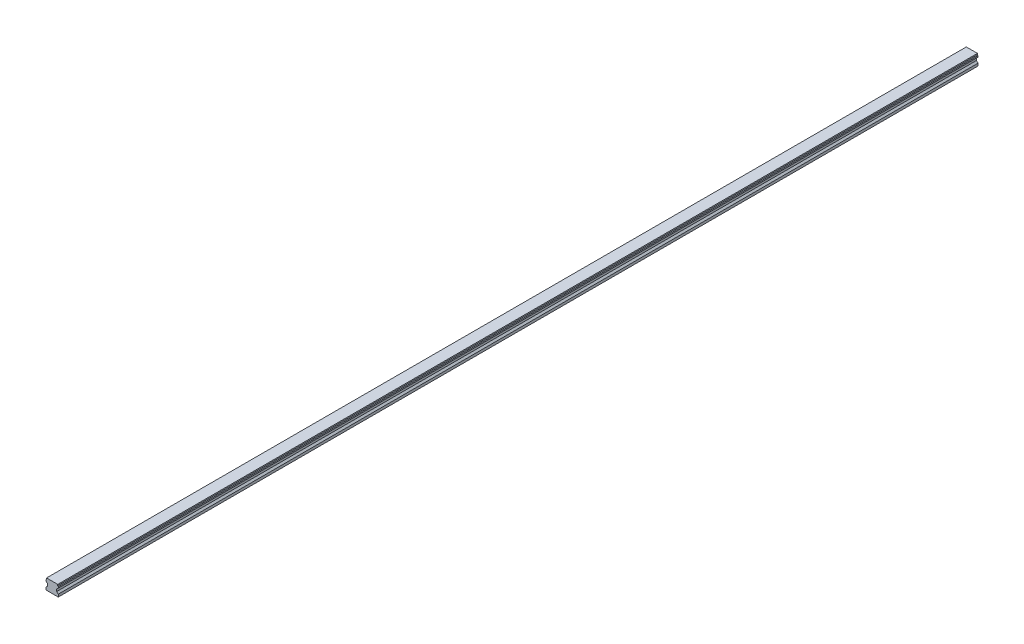
ISO-10303-21;
HEADER;
FILE_DESCRIPTION(('STEP AP214'),'2;1');
FILE_NAME('part.step','',(''),(''),'','','');
FILE_SCHEMA(('AUTOMOTIVE_DESIGN { 1 0 10303 214 1 1 1 1 }'));
ENDSEC;
DATA;
#1=APPLICATION_CONTEXT('core data for automotive mechanical design processes');
#2=APPLICATION_PROTOCOL_DEFINITION('international standard','automotive_design',2000,#1);
#3=PRODUCT_CONTEXT('',#1,'mechanical');
#4=PRODUCT('Part','Part','',(#3));
#5=PRODUCT_RELATED_PRODUCT_CATEGORY('part','',(#4));
#6=PRODUCT_DEFINITION_FORMATION('','',#4);
#7=PRODUCT_DEFINITION_CONTEXT('part definition',#1,'design');
#8=PRODUCT_DEFINITION('design','',#6,#7);
#9=PRODUCT_DEFINITION_SHAPE('','',#8);
#10=(LENGTH_UNIT() NAMED_UNIT(*) SI_UNIT(.MILLI.,.METRE.));
#11=(NAMED_UNIT(*) PLANE_ANGLE_UNIT() SI_UNIT($,.RADIAN.));
#12=(NAMED_UNIT(*) SI_UNIT($,.STERADIAN.) SOLID_ANGLE_UNIT());
#13=UNCERTAINTY_MEASURE_WITH_UNIT(LENGTH_MEASURE(1.E-05),#10,'distance_accuracy_value','');
#14=(GEOMETRIC_REPRESENTATION_CONTEXT(3) GLOBAL_UNCERTAINTY_ASSIGNED_CONTEXT((#13)) GLOBAL_UNIT_ASSIGNED_CONTEXT((#10,
#11,#12)) REPRESENTATION_CONTEXT('',''));
#15=CARTESIAN_POINT('',(0.,0.,0.));
#16=DIRECTION('',(0.,0.,1.));
#17=DIRECTION('',(1.,0.,0.));
#18=AXIS2_PLACEMENT_3D('',#15,#16,#17);
#19=CARTESIAN_POINT('',(9.1,0.,-1500.));
#20=DIRECTION('',(0.,1.,0.));
#21=DIRECTION('',(-1.,0.,0.));
#22=AXIS2_PLACEMENT_3D('',#19,#20,#21);
#23=PLANE('',#22);
#24=DIRECTION('',(-1.,0.,0.));
#25=VECTOR('',#24,1.);
#26=CARTESIAN_POINT('',(9.1,0.,0.));
#27=LINE('',#26,#25);
#28=CARTESIAN_POINT('',(9.1,0.,0.));
#29=VERTEX_POINT('',#28);
#30=CARTESIAN_POINT('',(-9.1,0.,0.));
#31=VERTEX_POINT('',#30);
#32=EDGE_CURVE('E186',#29,#31,#27,.T.);
#33=ORIENTED_EDGE('',*,*,#32,.F.);
#34=DIRECTION('',(0.,0.,1.));
#35=VECTOR('',#34,1.);
#36=CARTESIAN_POINT('',(9.1,0.,-1500.));
#37=LINE('',#36,#35);
#38=CARTESIAN_POINT('',(9.1,0.,-1500.));
#39=VERTEX_POINT('',#38);
#40=EDGE_CURVE('E11',#39,#29,#37,.T.);
#41=ORIENTED_EDGE('',*,*,#40,.F.);
#42=DIRECTION('',(-1.,0.,0.));
#43=VECTOR('',#42,1.);
#44=CARTESIAN_POINT('',(9.1,0.,-1500.));
#45=LINE('',#44,#43);
#46=CARTESIAN_POINT('',(-9.1,0.,-1500.));
#47=VERTEX_POINT('',#46);
#48=EDGE_CURVE('E230',#39,#47,#45,.T.);
#49=ORIENTED_EDGE('',*,*,#48,.T.);
#50=DIRECTION('',(0.,0.,1.));
#51=VECTOR('',#50,1.);
#52=CARTESIAN_POINT('',(-9.1,0.,-1500.));
#53=LINE('',#52,#51);
#54=EDGE_CURVE('E44',#47,#31,#53,.T.);
#55=ORIENTED_EDGE('',*,*,#54,.T.);
#56=EDGE_LOOP('',(#33,#41,#49,#55));
#57=FACE_BOUND('',#56,.T.);
#58=ADVANCED_FACE('F41',(#57),#23,.T.);
#59=CARTESIAN_POINT('',(9.1,0.,-1500.));
#60=DIRECTION('',(1.,0.,0.));
#61=DIRECTION('',(0.,0.,-1.));
#62=AXIS2_PLACEMENT_3D('',#59,#60,#61);
#63=PLANE('',#62);
#64=DIRECTION('',(0.,1.,0.));
#65=VECTOR('',#64,1.);
#66=CARTESIAN_POINT('',(9.1,0.,0.));
#67=LINE('',#66,#65);
#68=CARTESIAN_POINT('',(9.1,-2.,0.));
#69=VERTEX_POINT('',#68);
#70=EDGE_CURVE('E228',#69,#29,#67,.T.);
#71=ORIENTED_EDGE('',*,*,#70,.F.);
#72=DIRECTION('',(0.,0.,1.));
#73=VECTOR('',#72,1.);
#74=CARTESIAN_POINT('',(9.1,-2.,-1500.));
#75=LINE('',#74,#73);
#76=CARTESIAN_POINT('',(9.1,-2.,-1500.));
#77=VERTEX_POINT('',#76);
#78=EDGE_CURVE('E50',#77,#69,#75,.T.);
#79=ORIENTED_EDGE('',*,*,#78,.F.);
#80=DIRECTION('',(0.,1.,0.));
#81=VECTOR('',#80,1.);
#82=CARTESIAN_POINT('',(9.1,0.,-1500.));
#83=LINE('',#82,#81);
#84=EDGE_CURVE('E176',#77,#39,#83,.T.);
#85=ORIENTED_EDGE('',*,*,#84,.T.);
#86=ORIENTED_EDGE('',*,*,#40,.T.);
#87=EDGE_LOOP('',(#71,#79,#85,#86));
#88=FACE_BOUND('',#87,.T.);
#89=ADVANCED_FACE('F258',(#88),#63,.T.);
#90=CARTESIAN_POINT('',(9.1,-2.,-1500.));
#91=DIRECTION('',(0.707106781186546,0.707106781186549,0.));
#92=DIRECTION('',(-0.707106781186549,0.707106781186546,0.));
#93=AXIS2_PLACEMENT_3D('',#90,#91,#92);
#94=PLANE('',#93);
#95=DIRECTION('',(-0.707106781186549,0.707106781186546,0.));
#96=VECTOR('',#95,1.);
#97=CARTESIAN_POINT('',(9.1,-2.,0.));
#98=LINE('',#97,#96);
#99=CARTESIAN_POINT('',(10.,-2.9,0.));
#100=VERTEX_POINT('',#99);
#101=EDGE_CURVE('E163',#100,#69,#98,.T.);
#102=ORIENTED_EDGE('',*,*,#101,.F.);
#103=DIRECTION('',(0.,0.,1.));
#104=VECTOR('',#103,1.);
#105=CARTESIAN_POINT('',(10.,-2.9,-1500.));
#106=LINE('',#105,#104);
#107=CARTESIAN_POINT('',(10.,-2.9,-1500.));
#108=VERTEX_POINT('',#107);
#109=EDGE_CURVE('E158',#108,#100,#106,.T.);
#110=ORIENTED_EDGE('',*,*,#109,.F.);
#111=DIRECTION('',(-0.707106781186549,0.707106781186546,0.));
#112=VECTOR('',#111,1.);
#113=CARTESIAN_POINT('',(9.1,-2.,-1500.));
#114=LINE('',#113,#112);
#115=EDGE_CURVE('E161',#108,#77,#114,.T.);
#116=ORIENTED_EDGE('',*,*,#115,.T.);
#117=ORIENTED_EDGE('',*,*,#78,.T.);
#118=EDGE_LOOP('',(#102,#110,#116,#117));
#119=FACE_BOUND('',#118,.T.);
#120=ADVANCED_FACE('F160',(#119),#94,.T.);
#121=CARTESIAN_POINT('',(10.,-2.9,-1500.));
#122=DIRECTION('',(1.,0.,0.));
#123=DIRECTION('',(0.,0.,-1.));
#124=AXIS2_PLACEMENT_3D('',#121,#122,#123);
#125=PLANE('',#124);
#126=DIRECTION('',(0.,1.,0.));
#127=VECTOR('',#126,1.);
#128=CARTESIAN_POINT('',(10.,-2.9,0.));
#129=LINE('',#128,#127);
#130=CARTESIAN_POINT('',(10.,-4.9,0.));
#131=VERTEX_POINT('',#130);
#132=EDGE_CURVE('E225',#131,#100,#129,.T.);
#133=ORIENTED_EDGE('',*,*,#132,.F.);
#134=DIRECTION('',(0.,0.,1.));
#135=VECTOR('',#134,1.);
#136=CARTESIAN_POINT('',(10.,-4.9,-1500.));
#137=LINE('',#136,#135);
#138=CARTESIAN_POINT('',(10.,-4.9,-1500.));
#139=VERTEX_POINT('',#138);
#140=EDGE_CURVE('E168',#139,#131,#137,.T.);
#141=ORIENTED_EDGE('',*,*,#140,.F.);
#142=DIRECTION('',(0.,1.,0.));
#143=VECTOR('',#142,1.);
#144=CARTESIAN_POINT('',(10.,-2.9,-1500.));
#145=LINE('',#144,#143);
#146=EDGE_CURVE('E174',#139,#108,#145,.T.);
#147=ORIENTED_EDGE('',*,*,#146,.T.);
#148=ORIENTED_EDGE('',*,*,#109,.T.);
#149=EDGE_LOOP('',(#133,#141,#147,#148));
#150=FACE_BOUND('',#149,.T.);
#151=ADVANCED_FACE('F178',(#150),#125,.T.);
#152=CARTESIAN_POINT('',(10.,-4.9,-1500.));
#153=DIRECTION('',(0.707106781186549,-0.707106781186546,0.));
#154=DIRECTION('',(0.707106781186546,0.707106781186549,0.));
#155=AXIS2_PLACEMENT_3D('',#152,#153,#154);
#156=PLANE('',#155);
#157=DIRECTION('',(0.707106781186546,0.707106781186549,0.));
#158=VECTOR('',#157,1.);
#159=CARTESIAN_POINT('',(10.,-4.9,0.));
#160=LINE('',#159,#158);
#161=CARTESIAN_POINT('',(7.5,-7.40000000000001,0.));
#162=VERTEX_POINT('',#161);
#163=EDGE_CURVE('E222',#162,#131,#160,.T.);
#164=ORIENTED_EDGE('',*,*,#163,.F.);
#165=DIRECTION('',(0.,0.,1.));
#166=VECTOR('',#165,1.);
#167=CARTESIAN_POINT('',(7.5,-7.40000000000001,-1500.));
#168=LINE('',#167,#166);
#169=CARTESIAN_POINT('',(7.5,-7.40000000000001,-1500.));
#170=VERTEX_POINT('',#169);
#171=EDGE_CURVE('E234',#170,#162,#168,.T.);
#172=ORIENTED_EDGE('',*,*,#171,.F.);
#173=DIRECTION('',(0.707106781186546,0.707106781186549,0.));
#174=VECTOR('',#173,1.);
#175=CARTESIAN_POINT('',(10.,-4.9,-1500.));
#176=LINE('',#175,#174);
#177=EDGE_CURVE('E179',#170,#139,#176,.T.);
#178=ORIENTED_EDGE('',*,*,#177,.T.);
#179=ORIENTED_EDGE('',*,*,#140,.T.);
#180=EDGE_LOOP('',(#164,#172,#178,#179));
#181=FACE_BOUND('',#180,.T.);
#182=ADVANCED_FACE('F271',(#181),#156,.T.);
#183=CARTESIAN_POINT('',(7.5,-7.40000000000001,-1500.));
#184=DIRECTION('',(1.,0.,0.));
#185=DIRECTION('',(0.,1.,0.));
#186=AXIS2_PLACEMENT_3D('',#183,#184,#185);
#187=PLANE('',#186);
#188=DIRECTION('',(0.,1.,0.));
#189=VECTOR('',#188,1.);
#190=CARTESIAN_POINT('',(7.5,-7.40000000000001,0.));
#191=LINE('',#190,#189);
#192=CARTESIAN_POINT('',(7.5,-10.9,0.));
#193=VERTEX_POINT('',#192);
#194=EDGE_CURVE('E219',#193,#162,#191,.T.);
#195=ORIENTED_EDGE('',*,*,#194,.F.);
#196=DIRECTION('',(0.,0.,1.));
#197=VECTOR('',#196,1.);
#198=CARTESIAN_POINT('',(7.5,-10.9,-1500.));
#199=LINE('',#198,#197);
#200=CARTESIAN_POINT('',(7.5,-10.9,-1500.));
#201=VERTEX_POINT('',#200);
#202=EDGE_CURVE('E236',#201,#193,#199,.T.);
#203=ORIENTED_EDGE('',*,*,#202,.F.);
#204=DIRECTION('',(0.,1.,0.));
#205=VECTOR('',#204,1.);
#206=CARTESIAN_POINT('',(7.5,-7.40000000000001,-1500.));
#207=LINE('',#206,#205);
#208=EDGE_CURVE('E181',#201,#170,#207,.T.);
#209=ORIENTED_EDGE('',*,*,#208,.T.);
#210=ORIENTED_EDGE('',*,*,#171,.T.);
#211=EDGE_LOOP('',(#195,#203,#209,#210));
#212=FACE_BOUND('',#211,.T.);
#213=ADVANCED_FACE('F274',(#212),#187,.T.);
#214=CARTESIAN_POINT('',(7.5,-10.9,-1500.));
#215=DIRECTION('',(0.707106781186546,0.707106781186549,0.));
#216=DIRECTION('',(-0.707106781186549,0.707106781186546,0.));
#217=AXIS2_PLACEMENT_3D('',#214,#215,#216);
#218=PLANE('',#217);
#219=DIRECTION('',(-0.707106781186549,0.707106781186546,0.));
#220=VECTOR('',#219,1.);
#221=CARTESIAN_POINT('',(7.5,-10.9,0.));
#222=LINE('',#221,#220);
#223=CARTESIAN_POINT('',(10.,-13.4,0.));
#224=VERTEX_POINT('',#223);
#225=EDGE_CURVE('E216',#224,#193,#222,.T.);
#226=ORIENTED_EDGE('',*,*,#225,.F.);
#227=DIRECTION('',(0.,0.,1.));
#228=VECTOR('',#227,1.);
#229=CARTESIAN_POINT('',(10.,-13.4,-1500.));
#230=LINE('',#229,#228);
#231=CARTESIAN_POINT('',(10.,-13.4,-1500.));
#232=VERTEX_POINT('',#231);
#233=EDGE_CURVE('E238',#232,#224,#230,.T.);
#234=ORIENTED_EDGE('',*,*,#233,.F.);
#235=DIRECTION('',(-0.707106781186549,0.707106781186546,0.));
#236=VECTOR('',#235,1.);
#237=CARTESIAN_POINT('',(7.5,-10.9,-1500.));
#238=LINE('',#237,#236);
#239=EDGE_CURVE('E455',#232,#201,#238,.T.);
#240=ORIENTED_EDGE('',*,*,#239,.T.);
#241=ORIENTED_EDGE('',*,*,#202,.T.);
#242=EDGE_LOOP('',(#226,#234,#240,#241));
#243=FACE_BOUND('',#242,.T.);
#244=ADVANCED_FACE('F278',(#243),#218,.T.);
#245=CARTESIAN_POINT('',(10.,-13.4,-1500.));
#246=DIRECTION('',(1.,0.,0.));
#247=DIRECTION('',(0.,1.,0.));
#248=AXIS2_PLACEMENT_3D('',#245,#246,#247);
#249=PLANE('',#248);
#250=DIRECTION('',(0.,1.,0.));
#251=VECTOR('',#250,1.);
#252=CARTESIAN_POINT('',(10.,-13.4,0.));
#253=LINE('',#252,#251);
#254=CARTESIAN_POINT('',(10.,-17.5,0.));
#255=VERTEX_POINT('',#254);
#256=EDGE_CURVE('E213',#255,#224,#253,.T.);
#257=ORIENTED_EDGE('',*,*,#256,.F.);
#258=DIRECTION('',(0.,0.,1.));
#259=VECTOR('',#258,1.);
#260=CARTESIAN_POINT('',(10.,-17.5,-1500.));
#261=LINE('',#260,#259);
#262=CARTESIAN_POINT('',(10.,-17.5,-1500.));
#263=VERTEX_POINT('',#262);
#264=EDGE_CURVE('E240',#263,#255,#261,.T.);
#265=ORIENTED_EDGE('',*,*,#264,.F.);
#266=DIRECTION('',(0.,1.,0.));
#267=VECTOR('',#266,1.);
#268=CARTESIAN_POINT('',(10.,-13.4,-1500.));
#269=LINE('',#268,#267);
#270=EDGE_CURVE('E451',#263,#232,#269,.T.);
#271=ORIENTED_EDGE('',*,*,#270,.T.);
#272=ORIENTED_EDGE('',*,*,#233,.T.);
#273=EDGE_LOOP('',(#257,#265,#271,#272));
#274=FACE_BOUND('',#273,.T.);
#275=ADVANCED_FACE('F282',(#274),#249,.T.);
#276=CARTESIAN_POINT('',(10.,-17.5,-1500.));
#277=DIRECTION('',(0.,-1.,0.));
#278=DIRECTION('',(0.,0.,-1.));
#279=AXIS2_PLACEMENT_3D('',#276,#277,#278);
#280=PLANE('',#279);
#281=DIRECTION('',(1.,0.,0.));
#282=VECTOR('',#281,1.);
#283=CARTESIAN_POINT('',(10.,-17.5,0.));
#284=LINE('',#283,#282);
#285=CARTESIAN_POINT('',(-10.,-17.5,0.));
#286=VERTEX_POINT('',#285);
#287=EDGE_CURVE('E210',#286,#255,#284,.T.);
#288=ORIENTED_EDGE('',*,*,#287,.F.);
#289=DIRECTION('',(0.,0.,1.));
#290=VECTOR('',#289,1.);
#291=CARTESIAN_POINT('',(-10.,-17.5,-1500.));
#292=LINE('',#291,#290);
#293=CARTESIAN_POINT('',(-10.,-17.5,-1500.));
#294=VERTEX_POINT('',#293);
#295=EDGE_CURVE('E242',#294,#286,#292,.T.);
#296=ORIENTED_EDGE('',*,*,#295,.F.);
#297=DIRECTION('',(1.,0.,0.));
#298=VECTOR('',#297,1.);
#299=CARTESIAN_POINT('',(10.,-17.5,-1500.));
#300=LINE('',#299,#298);
#301=EDGE_CURVE('E462',#294,#263,#300,.T.);
#302=ORIENTED_EDGE('',*,*,#301,.T.);
#303=ORIENTED_EDGE('',*,*,#264,.T.);
#304=EDGE_LOOP('',(#288,#296,#302,#303));
#305=FACE_BOUND('',#304,.T.);
#306=ADVANCED_FACE('F286',(#305),#280,.T.);
#307=CARTESIAN_POINT('',(-10.,-13.4,-1500.));
#308=DIRECTION('',(-1.,0.,0.));
#309=DIRECTION('',(0.,-1.,0.));
#310=AXIS2_PLACEMENT_3D('',#307,#308,#309);
#311=PLANE('',#310);
#312=DIRECTION('',(0.,-1.,0.));
#313=VECTOR('',#312,1.);
#314=CARTESIAN_POINT('',(-10.,-13.4,0.));
#315=LINE('',#314,#313);
#316=CARTESIAN_POINT('',(-10.,-13.4,0.));
#317=VERTEX_POINT('',#316);
#318=EDGE_CURVE('E207',#317,#286,#315,.T.);
#319=ORIENTED_EDGE('',*,*,#318,.F.);
#320=DIRECTION('',(0.,0.,1.));
#321=VECTOR('',#320,1.);
#322=CARTESIAN_POINT('',(-10.,-13.4,-1500.));
#323=LINE('',#322,#321);
#324=CARTESIAN_POINT('',(-10.,-13.4,-1500.));
#325=VERTEX_POINT('',#324);
#326=EDGE_CURVE('E244',#325,#317,#323,.T.);
#327=ORIENTED_EDGE('',*,*,#326,.F.);
#328=DIRECTION('',(0.,-1.,0.));
#329=VECTOR('',#328,1.);
#330=CARTESIAN_POINT('',(-10.,-13.4,-1500.));
#331=LINE('',#330,#329);
#332=EDGE_CURVE('E444',#325,#294,#331,.T.);
#333=ORIENTED_EDGE('',*,*,#332,.T.);
#334=ORIENTED_EDGE('',*,*,#295,.T.);
#335=EDGE_LOOP('',(#319,#327,#333,#334));
#336=FACE_BOUND('',#335,.T.);
#337=ADVANCED_FACE('F290',(#336),#311,.T.);
#338=CARTESIAN_POINT('',(-7.5,-10.9,-1500.));
#339=DIRECTION('',(-0.707106781186546,0.707106781186549,0.));
#340=DIRECTION('',(-0.707106781186549,-0.707106781186546,0.));
#341=AXIS2_PLACEMENT_3D('',#338,#339,#340);
#342=PLANE('',#341);
#343=DIRECTION('',(-0.707106781186549,-0.707106781186546,0.));
#344=VECTOR('',#343,1.);
#345=CARTESIAN_POINT('',(-7.5,-10.9,0.));
#346=LINE('',#345,#344);
#347=CARTESIAN_POINT('',(-7.5,-10.9,0.));
#348=VERTEX_POINT('',#347);
#349=EDGE_CURVE('E204',#348,#317,#346,.T.);
#350=ORIENTED_EDGE('',*,*,#349,.F.);
#351=DIRECTION('',(0.,0.,1.));
#352=VECTOR('',#351,1.);
#353=CARTESIAN_POINT('',(-7.5,-10.9,-1500.));
#354=LINE('',#353,#352);
#355=CARTESIAN_POINT('',(-7.5,-10.9,-1500.));
#356=VERTEX_POINT('',#355);
#357=EDGE_CURVE('E246',#356,#348,#354,.T.);
#358=ORIENTED_EDGE('',*,*,#357,.F.);
#359=DIRECTION('',(-0.707106781186549,-0.707106781186546,0.));
#360=VECTOR('',#359,1.);
#361=CARTESIAN_POINT('',(-7.5,-10.9,-1500.));
#362=LINE('',#361,#360);
#363=EDGE_CURVE('E440',#356,#325,#362,.T.);
#364=ORIENTED_EDGE('',*,*,#363,.T.);
#365=ORIENTED_EDGE('',*,*,#326,.T.);
#366=EDGE_LOOP('',(#350,#358,#364,#365));
#367=FACE_BOUND('',#366,.T.);
#368=ADVANCED_FACE('F294',(#367),#342,.T.);
#369=CARTESIAN_POINT('',(-7.5,-7.40000000000001,-1500.));
#370=DIRECTION('',(-1.,0.,0.));
#371=DIRECTION('',(0.,-1.,0.));
#372=AXIS2_PLACEMENT_3D('',#369,#370,#371);
#373=PLANE('',#372);
#374=DIRECTION('',(0.,-1.,0.));
#375=VECTOR('',#374,1.);
#376=CARTESIAN_POINT('',(-7.5,-7.40000000000001,0.));
#377=LINE('',#376,#375);
#378=CARTESIAN_POINT('',(-7.5,-7.40000000000001,0.));
#379=VERTEX_POINT('',#378);
#380=EDGE_CURVE('E201',#379,#348,#377,.T.);
#381=ORIENTED_EDGE('',*,*,#380,.F.);
#382=DIRECTION('',(0.,0.,1.));
#383=VECTOR('',#382,1.);
#384=CARTESIAN_POINT('',(-7.5,-7.40000000000001,-1500.));
#385=LINE('',#384,#383);
#386=CARTESIAN_POINT('',(-7.5,-7.40000000000001,-1500.));
#387=VERTEX_POINT('',#386);
#388=EDGE_CURVE('E248',#387,#379,#385,.T.);
#389=ORIENTED_EDGE('',*,*,#388,.F.);
#390=DIRECTION('',(0.,-1.,0.));
#391=VECTOR('',#390,1.);
#392=CARTESIAN_POINT('',(-7.5,-7.40000000000001,-1500.));
#393=LINE('',#392,#391);
#394=EDGE_CURVE('E466',#387,#356,#393,.T.);
#395=ORIENTED_EDGE('',*,*,#394,.T.);
#396=ORIENTED_EDGE('',*,*,#357,.T.);
#397=EDGE_LOOP('',(#381,#389,#395,#396));
#398=FACE_BOUND('',#397,.T.);
#399=ADVANCED_FACE('F298',(#398),#373,.T.);
#400=CARTESIAN_POINT('',(-10.,-4.9,-1500.));
#401=DIRECTION('',(-0.707106781186548,-0.707106781186546,0.));
#402=DIRECTION('',(0.707106781186547,-0.707106781186549,0.));
#403=AXIS2_PLACEMENT_3D('',#400,#401,#402);
#404=PLANE('',#403);
#405=DIRECTION('',(0.707106781186546,-0.707106781186548,0.));
#406=VECTOR('',#405,1.);
#407=CARTESIAN_POINT('',(-10.,-4.9,0.));
#408=LINE('',#407,#406);
#409=CARTESIAN_POINT('',(-10.,-4.9,0.));
#410=VERTEX_POINT('',#409);
#411=EDGE_CURVE('E198',#410,#379,#408,.T.);
#412=ORIENTED_EDGE('',*,*,#411,.F.);
#413=DIRECTION('',(0.,0.,1.));
#414=VECTOR('',#413,1.);
#415=CARTESIAN_POINT('',(-10.,-4.9,-1500.));
#416=LINE('',#415,#414);
#417=CARTESIAN_POINT('',(-10.,-4.9,-1500.));
#418=VERTEX_POINT('',#417);
#419=EDGE_CURVE('E250',#418,#410,#416,.T.);
#420=ORIENTED_EDGE('',*,*,#419,.F.);
#421=DIRECTION('',(0.707106781186546,-0.707106781186548,0.));
#422=VECTOR('',#421,1.);
#423=CARTESIAN_POINT('',(-10.,-4.9,-1500.));
#424=LINE('',#423,#422);
#425=EDGE_CURVE('E433',#418,#387,#424,.T.);
#426=ORIENTED_EDGE('',*,*,#425,.T.);
#427=ORIENTED_EDGE('',*,*,#388,.T.);
#428=EDGE_LOOP('',(#412,#420,#426,#427));
#429=FACE_BOUND('',#428,.T.);
#430=ADVANCED_FACE('F302',(#429),#404,.T.);
#431=CARTESIAN_POINT('',(-10.,-2.9,-1500.));
#432=DIRECTION('',(-1.,0.,0.));
#433=DIRECTION('',(0.,0.,1.));
#434=AXIS2_PLACEMENT_3D('',#431,#432,#433);
#435=PLANE('',#434);
#436=DIRECTION('',(0.,-1.,0.));
#437=VECTOR('',#436,1.);
#438=CARTESIAN_POINT('',(-10.,-2.9,0.));
#439=LINE('',#438,#437);
#440=CARTESIAN_POINT('',(-10.,-2.9,0.));
#441=VERTEX_POINT('',#440);
#442=EDGE_CURVE('E195',#441,#410,#439,.T.);
#443=ORIENTED_EDGE('',*,*,#442,.F.);
#444=DIRECTION('',(0.,0.,1.));
#445=VECTOR('',#444,1.);
#446=CARTESIAN_POINT('',(-10.,-2.9,-1500.));
#447=LINE('',#446,#445);
#448=CARTESIAN_POINT('',(-10.,-2.9,-1500.));
#449=VERTEX_POINT('',#448);
#450=EDGE_CURVE('E252',#449,#441,#447,.T.);
#451=ORIENTED_EDGE('',*,*,#450,.F.);
#452=DIRECTION('',(0.,-1.,0.));
#453=VECTOR('',#452,1.);
#454=CARTESIAN_POINT('',(-10.,-2.9,-1500.));
#455=LINE('',#454,#453);
#456=EDGE_CURVE('E429',#449,#418,#455,.T.);
#457=ORIENTED_EDGE('',*,*,#456,.T.);
#458=ORIENTED_EDGE('',*,*,#419,.T.);
#459=EDGE_LOOP('',(#443,#451,#457,#458));
#460=FACE_BOUND('',#459,.T.);
#461=ADVANCED_FACE('F306',(#460),#435,.T.);
#462=CARTESIAN_POINT('',(-9.1,-2.,-1500.));
#463=DIRECTION('',(-0.707106781186546,0.707106781186549,0.));
#464=DIRECTION('',(-0.707106781186549,-0.707106781186546,0.));
#465=AXIS2_PLACEMENT_3D('',#462,#463,#464);
#466=PLANE('',#465);
#467=DIRECTION('',(-0.707106781186549,-0.707106781186546,0.));
#468=VECTOR('',#467,1.);
#469=CARTESIAN_POINT('',(-9.1,-2.,0.));
#470=LINE('',#469,#468);
#471=CARTESIAN_POINT('',(-9.1,-2.,0.));
#472=VERTEX_POINT('',#471);
#473=EDGE_CURVE('E192',#472,#441,#470,.T.);
#474=ORIENTED_EDGE('',*,*,#473,.F.);
#475=DIRECTION('',(0.,0.,1.));
#476=VECTOR('',#475,1.);
#477=CARTESIAN_POINT('',(-9.1,-2.,-1500.));
#478=LINE('',#477,#476);
#479=CARTESIAN_POINT('',(-9.1,-2.,-1500.));
#480=VERTEX_POINT('',#479);
#481=EDGE_CURVE('E253',#480,#472,#478,.T.);
#482=ORIENTED_EDGE('',*,*,#481,.F.);
#483=DIRECTION('',(-0.707106781186549,-0.707106781186546,0.));
#484=VECTOR('',#483,1.);
#485=CARTESIAN_POINT('',(-9.1,-2.,-1500.));
#486=LINE('',#485,#484);
#487=EDGE_CURVE('E470',#480,#449,#486,.T.);
#488=ORIENTED_EDGE('',*,*,#487,.T.);
#489=ORIENTED_EDGE('',*,*,#450,.T.);
#490=EDGE_LOOP('',(#474,#482,#488,#489));
#491=FACE_BOUND('',#490,.T.);
#492=ADVANCED_FACE('F310',(#491),#466,.T.);
#493=CARTESIAN_POINT('',(-9.1,0.,-1500.));
#494=DIRECTION('',(-1.,0.,0.));
#495=DIRECTION('',(0.,0.,1.));
#496=AXIS2_PLACEMENT_3D('',#493,#494,#495);
#497=PLANE('',#496);
#498=DIRECTION('',(0.,-1.,0.));
#499=VECTOR('',#498,1.);
#500=CARTESIAN_POINT('',(-9.1,0.,0.));
#501=LINE('',#500,#499);
#502=EDGE_CURVE('E189',#31,#472,#501,.T.);
#503=ORIENTED_EDGE('',*,*,#502,.F.);
#504=ORIENTED_EDGE('',*,*,#54,.F.);
#505=DIRECTION('',(0.,-1.,0.));
#506=VECTOR('',#505,1.);
#507=CARTESIAN_POINT('',(-9.1,0.,-1500.));
#508=LINE('',#507,#506);
#509=EDGE_CURVE('E472',#47,#480,#508,.T.);
#510=ORIENTED_EDGE('',*,*,#509,.T.);
#511=ORIENTED_EDGE('',*,*,#481,.T.);
#512=EDGE_LOOP('',(#503,#504,#510,#511));
#513=FACE_BOUND('',#512,.T.);
#514=ADVANCED_FACE('F255',(#513),#497,.T.);
#515=CARTESIAN_POINT('',(0.,0.,-1500.));
#516=DIRECTION('',(0.,0.,1.));
#517=DIRECTION('',(1.,0.,0.));
#518=AXIS2_PLACEMENT_3D('',#515,#516,#517);
#519=PLANE('',#518);
#520=ORIENTED_EDGE('',*,*,#48,.F.);
#521=ORIENTED_EDGE('',*,*,#84,.F.);
#522=ORIENTED_EDGE('',*,*,#115,.F.);
#523=ORIENTED_EDGE('',*,*,#146,.F.);
#524=ORIENTED_EDGE('',*,*,#177,.F.);
#525=ORIENTED_EDGE('',*,*,#208,.F.);
#526=ORIENTED_EDGE('',*,*,#239,.F.);
#527=ORIENTED_EDGE('',*,*,#270,.F.);
#528=ORIENTED_EDGE('',*,*,#301,.F.);
#529=ORIENTED_EDGE('',*,*,#332,.F.);
#530=ORIENTED_EDGE('',*,*,#363,.F.);
#531=ORIENTED_EDGE('',*,*,#394,.F.);
#532=ORIENTED_EDGE('',*,*,#425,.F.);
#533=ORIENTED_EDGE('',*,*,#456,.F.);
#534=ORIENTED_EDGE('',*,*,#487,.F.);
#535=ORIENTED_EDGE('',*,*,#509,.F.);
#536=EDGE_LOOP('',(#520,#521,#522,#523,#524,#525,#526,#527,#528,#529,#530,#531,#532,#533,#534,#535));
#537=FACE_BOUND('',#536,.T.);
#538=ADVANCED_FACE('F172',(#537),#519,.F.);
#539=CARTESIAN_POINT('',(0.,0.,0.));
#540=DIRECTION('',(0.,0.,1.));
#541=DIRECTION('',(1.,0.,0.));
#542=AXIS2_PLACEMENT_3D('',#539,#540,#541);
#543=PLANE('',#542);
#544=ORIENTED_EDGE('',*,*,#32,.T.);
#545=ORIENTED_EDGE('',*,*,#502,.T.);
#546=ORIENTED_EDGE('',*,*,#473,.T.);
#547=ORIENTED_EDGE('',*,*,#442,.T.);
#548=ORIENTED_EDGE('',*,*,#411,.T.);
#549=ORIENTED_EDGE('',*,*,#380,.T.);
#550=ORIENTED_EDGE('',*,*,#349,.T.);
#551=ORIENTED_EDGE('',*,*,#318,.T.);
#552=ORIENTED_EDGE('',*,*,#287,.T.);
#553=ORIENTED_EDGE('',*,*,#256,.T.);
#554=ORIENTED_EDGE('',*,*,#225,.T.);
#555=ORIENTED_EDGE('',*,*,#194,.T.);
#556=ORIENTED_EDGE('',*,*,#163,.T.);
#557=ORIENTED_EDGE('',*,*,#132,.T.);
#558=ORIENTED_EDGE('',*,*,#101,.T.);
#559=ORIENTED_EDGE('',*,*,#70,.T.);
#560=EDGE_LOOP('',(#544,#545,#546,#547,#548,#549,#550,#551,#552,#553,#554,#555,#556,#557,#558,#559));
#561=FACE_BOUND('',#560,.T.);
#562=ADVANCED_FACE('F257',(#561),#543,.T.);
#563=CLOSED_SHELL('',(#58,#89,#120,#151,#182,#213,#244,#275,#306,#337,#368,#399,#430,#461,#492,
#514,#538,#562));
#564=MANIFOLD_SOLID_BREP('B2',#563);
#565=ADVANCED_BREP_SHAPE_REPRESENTATION('',(#18,#564),#14);
#566=SHAPE_DEFINITION_REPRESENTATION(#9,#565);
ENDSEC;
END-ISO-10303-21;
